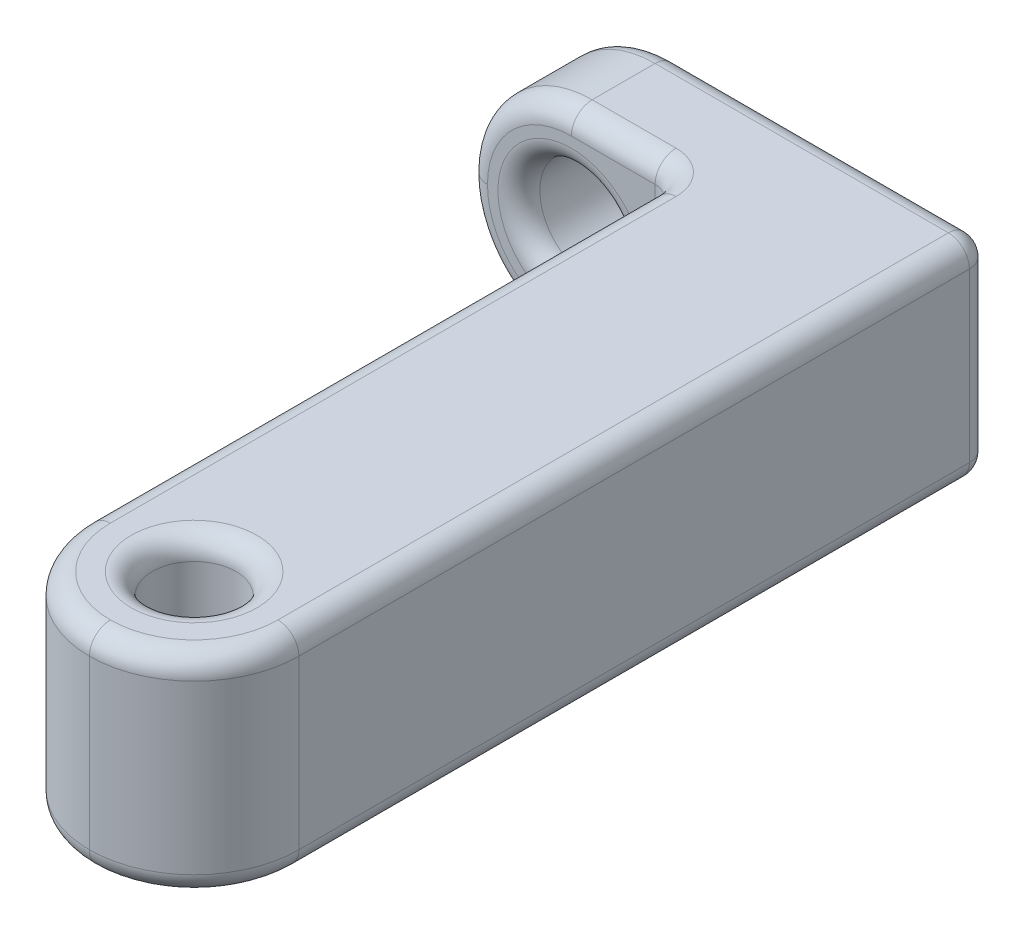
ISO-10303-21;
HEADER;
FILE_DESCRIPTION(('STEP AP214'),'2;1');
FILE_NAME('part.step','',(''),(''),'','','');
FILE_SCHEMA(('AUTOMOTIVE_DESIGN { 1 0 10303 214 1 1 1 1 }'));
ENDSEC;
DATA;
#1=APPLICATION_CONTEXT('core data for automotive mechanical design processes');
#2=APPLICATION_PROTOCOL_DEFINITION('international standard','automotive_design',2000,#1);
#3=PRODUCT_CONTEXT('',#1,'mechanical');
#4=PRODUCT('Part','Part','',(#3));
#5=PRODUCT_RELATED_PRODUCT_CATEGORY('part','',(#4));
#6=PRODUCT_DEFINITION_FORMATION('','',#4);
#7=PRODUCT_DEFINITION_CONTEXT('part definition',#1,'design');
#8=PRODUCT_DEFINITION('design','',#6,#7);
#9=PRODUCT_DEFINITION_SHAPE('','',#8);
#10=(LENGTH_UNIT() NAMED_UNIT(*) SI_UNIT(.MILLI.,.METRE.));
#11=(NAMED_UNIT(*) PLANE_ANGLE_UNIT() SI_UNIT($,.RADIAN.));
#12=(NAMED_UNIT(*) SI_UNIT($,.STERADIAN.) SOLID_ANGLE_UNIT());
#13=UNCERTAINTY_MEASURE_WITH_UNIT(LENGTH_MEASURE(1.E-05),#10,'distance_accuracy_value','');
#14=(GEOMETRIC_REPRESENTATION_CONTEXT(3) GLOBAL_UNCERTAINTY_ASSIGNED_CONTEXT((#13)) GLOBAL_UNIT_ASSIGNED_CONTEXT((#10,
#11,#12)) REPRESENTATION_CONTEXT('',''));
#15=CARTESIAN_POINT('',(0.,0.,0.));
#16=DIRECTION('',(0.,0.,1.));
#17=DIRECTION('',(1.,0.,0.));
#18=AXIS2_PLACEMENT_3D('',#15,#16,#17);
#19=CARTESIAN_POINT('',(0.,5.,5.));
#20=DIRECTION('',(0.,1.,0.));
#21=DIRECTION('',(0.,0.,1.));
#22=AXIS2_PLACEMENT_3D('',#19,#20,#21);
#23=PLANE('',#22);
#24=CARTESIAN_POINT('',(5.,5.,33.));
#25=DIRECTION('',(0.,1.,0.));
#26=DIRECTION('',(0.,0.,1.));
#27=AXIS2_PLACEMENT_3D('',#24,#25,#26);
#28=CIRCLE('',#27,3.);
#29=CARTESIAN_POINT('',(5.,5.,36.));
#30=VERTEX_POINT('',#29);
#31=EDGE_CURVE('E252',#30,#30,#28,.F.);
#32=ORIENTED_EDGE('',*,*,#31,.T.);
#33=EDGE_LOOP('',(#32));
#34=FACE_BOUND('',#33,.T.);
#35=DIRECTION('',(0.,0.,-1.));
#36=VECTOR('',#35,1.);
#37=CARTESIAN_POINT('',(-5.,5.,5.));
#38=LINE('',#37,#36);
#39=CARTESIAN_POINT('',(-5.,5.,1.));
#40=VERTEX_POINT('',#39);
#41=CARTESIAN_POINT('',(-5.,5.,4.));
#42=VERTEX_POINT('',#41);
#43=EDGE_CURVE('E447',#40,#42,#38,.F.);
#44=ORIENTED_EDGE('',*,*,#43,.T.);
#45=DIRECTION('',(1.,0.,0.));
#46=VECTOR('',#45,1.);
#47=CARTESIAN_POINT('',(0.,5.,4.));
#48=LINE('',#47,#46);
#49=CARTESIAN_POINT('',(-1.,5.,4.));
#50=VERTEX_POINT('',#49);
#51=EDGE_CURVE('E249',#42,#50,#48,.T.);
#52=ORIENTED_EDGE('',*,*,#51,.T.);
#53=CARTESIAN_POINT('',(-1.,5.,6.));
#54=DIRECTION('',(0.,1.,0.));
#55=DIRECTION('',(0.,0.,1.));
#56=AXIS2_PLACEMENT_3D('',#53,#54,#55);
#57=CIRCLE('',#56,2.);
#58=CARTESIAN_POINT('',(1.,5.,6.));
#59=VERTEX_POINT('',#58);
#60=EDGE_CURVE('E245',#59,#50,#57,.T.);
#61=ORIENTED_EDGE('',*,*,#60,.F.);
#62=DIRECTION('',(0.,0.,-1.));
#63=VECTOR('',#62,1.);
#64=CARTESIAN_POINT('',(1.,5.,33.));
#65=LINE('',#64,#63);
#66=CARTESIAN_POINT('',(1.,5.,33.));
#67=VERTEX_POINT('',#66);
#68=EDGE_CURVE('E235',#59,#67,#65,.F.);
#69=ORIENTED_EDGE('',*,*,#68,.T.);
#70=CARTESIAN_POINT('',(5.,5.,33.));
#71=DIRECTION('',(0.,1.,0.));
#72=DIRECTION('',(0.,0.,1.));
#73=AXIS2_PLACEMENT_3D('',#70,#71,#72);
#74=CIRCLE('',#73,4.);
#75=CARTESIAN_POINT('',(5.,5.,37.));
#76=VERTEX_POINT('',#75);
#77=EDGE_CURVE('E232',#67,#76,#74,.T.);
#78=ORIENTED_EDGE('',*,*,#77,.T.);
#79=CARTESIAN_POINT('',(5.,5.,33.));
#80=DIRECTION('',(0.,1.,0.));
#81=DIRECTION('',(0.,0.,1.));
#82=AXIS2_PLACEMENT_3D('',#79,#80,#81);
#83=CIRCLE('',#82,4.);
#84=CARTESIAN_POINT('',(9.00000000000001,5.,33.));
#85=VERTEX_POINT('',#84);
#86=EDGE_CURVE('E229',#76,#85,#83,.T.);
#87=ORIENTED_EDGE('',*,*,#86,.T.);
#88=DIRECTION('',(0.,0.,-1.));
#89=VECTOR('',#88,1.);
#90=CARTESIAN_POINT('',(9.00000000000001,5.,0.));
#91=LINE('',#90,#89);
#92=CARTESIAN_POINT('',(9.00000000000001,5.,1.));
#93=VERTEX_POINT('',#92);
#94=EDGE_CURVE('E238',#85,#93,#91,.T.);
#95=ORIENTED_EDGE('',*,*,#94,.T.);
#96=DIRECTION('',(1.,0.,0.));
#97=VECTOR('',#96,1.);
#98=CARTESIAN_POINT('',(-5.,5.,1.));
#99=LINE('',#98,#97);
#100=EDGE_CURVE('E241',#93,#40,#99,.F.);
#101=ORIENTED_EDGE('',*,*,#100,.T.);
#102=EDGE_LOOP('',(#44,#52,#61,#69,#78,#87,#95,#101));
#103=FACE_BOUND('',#102,.T.);
#104=ADVANCED_FACE('F45',(#34,#103),#23,.T.);
#105=CARTESIAN_POINT('',(0.,-5.,5.));
#106=DIRECTION('',(0.,1.,0.));
#107=DIRECTION('',(0.,0.,1.));
#108=AXIS2_PLACEMENT_3D('',#105,#106,#107);
#109=PLANE('',#108);
#110=CARTESIAN_POINT('',(5.,-5.,33.));
#111=DIRECTION('',(0.,1.,0.));
#112=DIRECTION('',(0.,0.,1.));
#113=AXIS2_PLACEMENT_3D('',#110,#111,#112);
#114=CIRCLE('',#113,3.);
#115=CARTESIAN_POINT('',(5.,-5.,36.));
#116=VERTEX_POINT('',#115);
#117=EDGE_CURVE('E296',#116,#116,#114,.T.);
#118=ORIENTED_EDGE('',*,*,#117,.T.);
#119=EDGE_LOOP('',(#118));
#120=FACE_BOUND('',#119,.T.);
#121=CARTESIAN_POINT('',(-0.999999999999999,-5.,6.));
#122=DIRECTION('',(0.,1.,0.));
#123=DIRECTION('',(0.,0.,1.));
#124=AXIS2_PLACEMENT_3D('',#121,#122,#123);
#125=CIRCLE('',#124,2.);
#126=CARTESIAN_POINT('',(-0.999999999999999,-5.,4.));
#127=VERTEX_POINT('',#126);
#128=CARTESIAN_POINT('',(1.,-5.,6.));
#129=VERTEX_POINT('',#128);
#130=EDGE_CURVE('E289',#127,#129,#125,.F.);
#131=ORIENTED_EDGE('',*,*,#130,.F.);
#132=DIRECTION('',(1.,0.,0.));
#133=VECTOR('',#132,1.);
#134=CARTESIAN_POINT('',(-5.,-5.,4.));
#135=LINE('',#134,#133);
#136=CARTESIAN_POINT('',(-5.,-5.,4.));
#137=VERTEX_POINT('',#136);
#138=EDGE_CURVE('E293',#127,#137,#135,.F.);
#139=ORIENTED_EDGE('',*,*,#138,.T.);
#140=DIRECTION('',(0.,0.,-1.));
#141=VECTOR('',#140,1.);
#142=CARTESIAN_POINT('',(-5.,-5.,0.));
#143=LINE('',#142,#141);
#144=CARTESIAN_POINT('',(-5.,-5.,1.));
#145=VERTEX_POINT('',#144);
#146=EDGE_CURVE('E453',#137,#145,#143,.T.);
#147=ORIENTED_EDGE('',*,*,#146,.T.);
#148=DIRECTION('',(1.,0.,0.));
#149=VECTOR('',#148,1.);
#150=CARTESIAN_POINT('',(0.,-5.,1.));
#151=LINE('',#150,#149);
#152=CARTESIAN_POINT('',(9.00000000000001,-5.,1.));
#153=VERTEX_POINT('',#152);
#154=EDGE_CURVE('E286',#145,#153,#151,.T.);
#155=ORIENTED_EDGE('',*,*,#154,.T.);
#156=DIRECTION('',(0.,0.,-1.));
#157=VECTOR('',#156,1.);
#158=CARTESIAN_POINT('',(9.00000000000001,-5.,5.));
#159=LINE('',#158,#157);
#160=CARTESIAN_POINT('',(9.00000000000001,-5.,33.));
#161=VERTEX_POINT('',#160);
#162=EDGE_CURVE('E280',#153,#161,#159,.F.);
#163=ORIENTED_EDGE('',*,*,#162,.T.);
#164=CARTESIAN_POINT('',(5.,-5.,33.));
#165=DIRECTION('',(0.,1.,0.));
#166=DIRECTION('',(0.,0.,1.));
#167=AXIS2_PLACEMENT_3D('',#164,#165,#166);
#168=CIRCLE('',#167,4.);
#169=CARTESIAN_POINT('',(5.,-5.,37.));
#170=VERTEX_POINT('',#169);
#171=EDGE_CURVE('E274',#161,#170,#168,.F.);
#172=ORIENTED_EDGE('',*,*,#171,.T.);
#173=CARTESIAN_POINT('',(5.,-5.,33.));
#174=DIRECTION('',(0.,1.,0.));
#175=DIRECTION('',(0.,0.,1.));
#176=AXIS2_PLACEMENT_3D('',#173,#174,#175);
#177=CIRCLE('',#176,4.);
#178=CARTESIAN_POINT('',(1.,-5.,33.));
#179=VERTEX_POINT('',#178);
#180=EDGE_CURVE('E277',#170,#179,#177,.F.);
#181=ORIENTED_EDGE('',*,*,#180,.T.);
#182=DIRECTION('',(0.,0.,-1.));
#183=VECTOR('',#182,1.);
#184=CARTESIAN_POINT('',(1.,-5.,5.));
#185=LINE('',#184,#183);
#186=EDGE_CURVE('E283',#179,#129,#185,.T.);
#187=ORIENTED_EDGE('',*,*,#186,.T.);
#188=EDGE_LOOP('',(#131,#139,#147,#155,#163,#172,#181,#187));
#189=FACE_BOUND('',#188,.T.);
#190=ADVANCED_FACE('F464',(#120,#189),#109,.F.);
#191=CARTESIAN_POINT('',(-5.,0.,5.));
#192=DIRECTION('',(0.,0.,-1.));
#193=DIRECTION('',(-1.,0.,0.));
#194=AXIS2_PLACEMENT_3D('',#191,#192,#193);
#195=CYLINDRICAL_SURFACE('',#194,2.5);
#196=CARTESIAN_POINT('',(-5.,0.,1.));
#197=DIRECTION('',(0.,0.,1.));
#198=DIRECTION('',(1.,0.,0.));
#199=AXIS2_PLACEMENT_3D('',#196,#197,#198);
#200=CIRCLE('',#199,2.5);
#201=CARTESIAN_POINT('',(-2.5,0.,1.));
#202=VERTEX_POINT('',#201);
#203=EDGE_CURVE('E313',#202,#202,#200,.F.);
#204=ORIENTED_EDGE('',*,*,#203,.T.);
#205=EDGE_LOOP('',(#204));
#206=FACE_BOUND('',#205,.T.);
#207=CARTESIAN_POINT('',(-5.,0.,4.));
#208=DIRECTION('',(0.,0.,1.));
#209=DIRECTION('',(1.,0.,0.));
#210=AXIS2_PLACEMENT_3D('',#207,#208,#209);
#211=CIRCLE('',#210,2.5);
#212=CARTESIAN_POINT('',(-2.5,0.,4.));
#213=VERTEX_POINT('',#212);
#214=EDGE_CURVE('E309',#213,#213,#211,.T.);
#215=ORIENTED_EDGE('',*,*,#214,.T.);
#216=EDGE_LOOP('',(#215));
#217=FACE_BOUND('',#216,.T.);
#218=ADVANCED_FACE('F521',(#206,#217),#195,.F.);
#219=CARTESIAN_POINT('',(0.,0.,5.));
#220=DIRECTION('',(0.,0.,1.));
#221=DIRECTION('',(1.,0.,0.));
#222=AXIS2_PLACEMENT_3D('',#219,#220,#221);
#223=PLANE('',#222);
#224=CARTESIAN_POINT('',(-5.,0.,5.));
#225=DIRECTION('',(0.,0.,1.));
#226=DIRECTION('',(1.,0.,0.));
#227=AXIS2_PLACEMENT_3D('',#224,#225,#226);
#228=CIRCLE('',#227,3.5);
#229=CARTESIAN_POINT('',(-1.5,0.,5.));
#230=VERTEX_POINT('',#229);
#231=EDGE_CURVE('E333',#230,#230,#228,.F.);
#232=ORIENTED_EDGE('',*,*,#231,.T.);
#233=EDGE_LOOP('',(#232));
#234=FACE_BOUND('',#233,.T.);
#235=DIRECTION('',(1.,0.,0.));
#236=VECTOR('',#235,1.);
#237=CARTESIAN_POINT('',(0.,-4.,5.));
#238=LINE('',#237,#236);
#239=CARTESIAN_POINT('',(-5.,-4.,5.));
#240=VERTEX_POINT('',#239);
#241=CARTESIAN_POINT('',(-0.999999999999999,-4.,5.));
#242=VERTEX_POINT('',#241);
#243=EDGE_CURVE('E323',#240,#242,#238,.T.);
#244=ORIENTED_EDGE('',*,*,#243,.T.);
#245=DIRECTION('',(0.,-1.,0.));
#246=VECTOR('',#245,1.);
#247=CARTESIAN_POINT('',(-0.999999999999999,0.,5.));
#248=LINE('',#247,#246);
#249=CARTESIAN_POINT('',(-1.,4.,5.));
#250=VERTEX_POINT('',#249);
#251=EDGE_CURVE('E330',#242,#250,#248,.F.);
#252=ORIENTED_EDGE('',*,*,#251,.T.);
#253=DIRECTION('',(1.,0.,0.));
#254=VECTOR('',#253,1.);
#255=CARTESIAN_POINT('',(0.,4.,5.));
#256=LINE('',#255,#254);
#257=CARTESIAN_POINT('',(-5.,4.,5.));
#258=VERTEX_POINT('',#257);
#259=EDGE_CURVE('E326',#250,#258,#256,.F.);
#260=ORIENTED_EDGE('',*,*,#259,.T.);
#261=CARTESIAN_POINT('',(-5.,0.,5.));
#262=DIRECTION('',(0.,0.,1.));
#263=DIRECTION('',(1.,0.,0.));
#264=AXIS2_PLACEMENT_3D('',#261,#262,#263);
#265=CIRCLE('',#264,4.);
#266=CARTESIAN_POINT('',(-9.,0.,5.));
#267=VERTEX_POINT('',#266);
#268=EDGE_CURVE('E317',#258,#267,#265,.T.);
#269=ORIENTED_EDGE('',*,*,#268,.T.);
#270=CARTESIAN_POINT('',(-5.,0.,5.));
#271=DIRECTION('',(0.,0.,1.));
#272=DIRECTION('',(1.,0.,0.));
#273=AXIS2_PLACEMENT_3D('',#270,#271,#272);
#274=CIRCLE('',#273,4.);
#275=EDGE_CURVE('E320',#267,#240,#274,.T.);
#276=ORIENTED_EDGE('',*,*,#275,.T.);
#277=EDGE_LOOP('',(#244,#252,#260,#269,#276));
#278=FACE_BOUND('',#277,.T.);
#279=ADVANCED_FACE('F528',(#234,#278),#223,.T.);
#280=CARTESIAN_POINT('',(0.,0.,0.));
#281=DIRECTION('',(0.,0.,1.));
#282=DIRECTION('',(1.,0.,0.));
#283=AXIS2_PLACEMENT_3D('',#280,#281,#282);
#284=PLANE('',#283);
#285=CARTESIAN_POINT('',(-5.,0.,0.));
#286=DIRECTION('',(0.,0.,1.));
#287=DIRECTION('',(1.,0.,0.));
#288=AXIS2_PLACEMENT_3D('',#285,#286,#287);
#289=CIRCLE('',#288,3.5);
#290=CARTESIAN_POINT('',(-1.5,0.,0.));
#291=VERTEX_POINT('',#290);
#292=EDGE_CURVE('E225',#291,#291,#289,.T.);
#293=ORIENTED_EDGE('',*,*,#292,.T.);
#294=EDGE_LOOP('',(#293));
#295=FACE_BOUND('',#294,.T.);
#296=CARTESIAN_POINT('',(-5.,0.,0.));
#297=DIRECTION('',(0.,0.,1.));
#298=DIRECTION('',(1.,0.,0.));
#299=AXIS2_PLACEMENT_3D('',#296,#297,#298);
#300=CIRCLE('',#299,4.);
#301=CARTESIAN_POINT('',(-9.,0.,0.));
#302=VERTEX_POINT('',#301);
#303=CARTESIAN_POINT('',(-5.,4.,0.));
#304=VERTEX_POINT('',#303);
#305=EDGE_CURVE('E183',#302,#304,#300,.F.);
#306=ORIENTED_EDGE('',*,*,#305,.T.);
#307=DIRECTION('',(1.,0.,0.));
#308=VECTOR('',#307,1.);
#309=CARTESIAN_POINT('',(10.,4.,0.));
#310=LINE('',#309,#308);
#311=CARTESIAN_POINT('',(9.00000000000001,4.,0.));
#312=VERTEX_POINT('',#311);
#313=EDGE_CURVE('E222',#304,#312,#310,.T.);
#314=ORIENTED_EDGE('',*,*,#313,.T.);
#315=DIRECTION('',(0.,1.,0.));
#316=VECTOR('',#315,1.);
#317=CARTESIAN_POINT('',(9.00000000000001,0.,0.));
#318=LINE('',#317,#316);
#319=CARTESIAN_POINT('',(9.00000000000001,-4.,0.));
#320=VERTEX_POINT('',#319);
#321=EDGE_CURVE('E219',#312,#320,#318,.F.);
#322=ORIENTED_EDGE('',*,*,#321,.T.);
#323=DIRECTION('',(1.,0.,0.));
#324=VECTOR('',#323,1.);
#325=CARTESIAN_POINT('',(0.,-4.,0.));
#326=LINE('',#325,#324);
#327=CARTESIAN_POINT('',(-5.,-4.,0.));
#328=VERTEX_POINT('',#327);
#329=EDGE_CURVE('E186',#320,#328,#326,.F.);
#330=ORIENTED_EDGE('',*,*,#329,.T.);
#331=CARTESIAN_POINT('',(-5.,0.,0.));
#332=DIRECTION('',(0.,0.,1.));
#333=DIRECTION('',(1.,0.,0.));
#334=AXIS2_PLACEMENT_3D('',#331,#332,#333);
#335=CIRCLE('',#334,4.);
#336=EDGE_CURVE('E178',#328,#302,#335,.F.);
#337=ORIENTED_EDGE('',*,*,#336,.T.);
#338=EDGE_LOOP('',(#306,#314,#322,#330,#337));
#339=FACE_BOUND('',#338,.T.);
#340=ADVANCED_FACE('F180',(#295,#339),#284,.F.);
#341=CARTESIAN_POINT('',(0.,0.,38.));
#342=DIRECTION('',(1.,0.,0.));
#343=DIRECTION('',(0.,1.,0.));
#344=AXIS2_PLACEMENT_3D('',#341,#342,#343);
#345=PLANE('',#344);
#346=DIRECTION('',(0.,-1.,0.));
#347=VECTOR('',#346,1.);
#348=CARTESIAN_POINT('',(0.,0.,6.));
#349=LINE('',#348,#347);
#350=CARTESIAN_POINT('',(0.,4.,6.));
#351=VERTEX_POINT('',#350);
#352=CARTESIAN_POINT('',(0.,-4.,6.));
#353=VERTEX_POINT('',#352);
#354=EDGE_CURVE('E300',#351,#353,#349,.T.);
#355=ORIENTED_EDGE('',*,*,#354,.T.);
#356=DIRECTION('',(0.,0.,-1.));
#357=VECTOR('',#356,1.);
#358=CARTESIAN_POINT('',(0.,-4.,38.));
#359=LINE('',#358,#357);
#360=CARTESIAN_POINT('',(0.,-4.,33.));
#361=VERTEX_POINT('',#360);
#362=EDGE_CURVE('E306',#353,#361,#359,.F.);
#363=ORIENTED_EDGE('',*,*,#362,.T.);
#364=DIRECTION('',(0.,-1.,0.));
#365=VECTOR('',#364,1.);
#366=CARTESIAN_POINT('',(0.,5.,33.));
#367=LINE('',#366,#365);
#368=CARTESIAN_POINT('',(0.,4.,33.));
#369=VERTEX_POINT('',#368);
#370=EDGE_CURVE('E207',#361,#369,#367,.F.);
#371=ORIENTED_EDGE('',*,*,#370,.T.);
#372=DIRECTION('',(0.,0.,-1.));
#373=VECTOR('',#372,1.);
#374=CARTESIAN_POINT('',(0.,4.,5.));
#375=LINE('',#374,#373);
#376=EDGE_CURVE('E303',#369,#351,#375,.T.);
#377=ORIENTED_EDGE('',*,*,#376,.T.);
#378=EDGE_LOOP('',(#355,#363,#371,#377));
#379=FACE_BOUND('',#378,.T.);
#380=ADVANCED_FACE('F843',(#379),#345,.F.);
#381=CARTESIAN_POINT('',(10.,0.,38.));
#382=DIRECTION('',(-1.,0.,0.));
#383=DIRECTION('',(0.,0.,1.));
#384=AXIS2_PLACEMENT_3D('',#381,#382,#383);
#385=PLANE('',#384);
#386=DIRECTION('',(0.,1.,0.));
#387=VECTOR('',#386,1.);
#388=CARTESIAN_POINT('',(10.,0.,1.));
#389=LINE('',#388,#387);
#390=CARTESIAN_POINT('',(10.,-4.,1.));
#391=VERTEX_POINT('',#390);
#392=CARTESIAN_POINT('',(10.,4.,1.));
#393=VERTEX_POINT('',#392);
#394=EDGE_CURVE('E259',#391,#393,#389,.T.);
#395=ORIENTED_EDGE('',*,*,#394,.T.);
#396=DIRECTION('',(0.,0.,-1.));
#397=VECTOR('',#396,1.);
#398=CARTESIAN_POINT('',(10.,4.,33.));
#399=LINE('',#398,#397);
#400=CARTESIAN_POINT('',(10.,4.,33.));
#401=VERTEX_POINT('',#400);
#402=EDGE_CURVE('E263',#393,#401,#399,.F.);
#403=ORIENTED_EDGE('',*,*,#402,.T.);
#404=DIRECTION('',(0.,1.,0.));
#405=VECTOR('',#404,1.);
#406=CARTESIAN_POINT('',(10.,-5.,33.));
#407=LINE('',#406,#405);
#408=CARTESIAN_POINT('',(10.,-4.,33.));
#409=VERTEX_POINT('',#408);
#410=EDGE_CURVE('E211',#401,#409,#407,.F.);
#411=ORIENTED_EDGE('',*,*,#410,.T.);
#412=DIRECTION('',(0.,0.,-1.));
#413=VECTOR('',#412,1.);
#414=CARTESIAN_POINT('',(10.,-4.,38.));
#415=LINE('',#414,#413);
#416=EDGE_CURVE('E256',#409,#391,#415,.T.);
#417=ORIENTED_EDGE('',*,*,#416,.T.);
#418=EDGE_LOOP('',(#395,#403,#411,#417));
#419=FACE_BOUND('',#418,.T.);
#420=ADVANCED_FACE('F511',(#419),#385,.F.);
#421=CARTESIAN_POINT('',(5.,5.001,33.));
#422=DIRECTION('',(0.,-1.,0.));
#423=DIRECTION('',(0.,0.,-1.));
#424=AXIS2_PLACEMENT_3D('',#421,#422,#423);
#425=CYLINDRICAL_SURFACE('',#424,2.);
#426=CARTESIAN_POINT('',(5.,4.,33.));
#427=DIRECTION('',(0.,1.,0.));
#428=DIRECTION('',(0.,0.,1.));
#429=AXIS2_PLACEMENT_3D('',#426,#427,#428);
#430=CIRCLE('',#429,2.);
#431=CARTESIAN_POINT('',(5.,4.,35.));
#432=VERTEX_POINT('',#431);
#433=EDGE_CURVE('E270',#432,#432,#430,.T.);
#434=ORIENTED_EDGE('',*,*,#433,.T.);
#435=EDGE_LOOP('',(#434));
#436=FACE_BOUND('',#435,.T.);
#437=CARTESIAN_POINT('',(5.,-4.,33.));
#438=DIRECTION('',(0.,1.,0.));
#439=DIRECTION('',(0.,0.,1.));
#440=AXIS2_PLACEMENT_3D('',#437,#438,#439);
#441=CIRCLE('',#440,2.);
#442=CARTESIAN_POINT('',(5.,-4.,35.));
#443=VERTEX_POINT('',#442);
#444=EDGE_CURVE('E266',#443,#443,#441,.F.);
#445=ORIENTED_EDGE('',*,*,#444,.T.);
#446=EDGE_LOOP('',(#445));
#447=FACE_BOUND('',#446,.T.);
#448=ADVANCED_FACE('F503',(#436,#447),#425,.F.);
#449=CARTESIAN_POINT('',(-5.,0.,5.));
#450=DIRECTION('',(0.,0.,1.));
#451=DIRECTION('',(1.,0.,0.));
#452=AXIS2_PLACEMENT_3D('',#449,#450,#451);
#453=CYLINDRICAL_SURFACE('',#452,5.);
#454=DIRECTION('',(0.,0.,-1.));
#455=VECTOR('',#454,1.);
#456=CARTESIAN_POINT('',(-10.,0.,5.));
#457=LINE('',#456,#455);
#458=CARTESIAN_POINT('',(-10.,0.,1.));
#459=VERTEX_POINT('',#458);
#460=CARTESIAN_POINT('',(-10.,0.,4.));
#461=VERTEX_POINT('',#460);
#462=EDGE_CURVE('E443',#459,#461,#457,.F.);
#463=ORIENTED_EDGE('',*,*,#462,.F.);
#464=CARTESIAN_POINT('',(-5.,0.,1.));
#465=DIRECTION('',(0.,0.,1.));
#466=DIRECTION('',(1.,0.,0.));
#467=AXIS2_PLACEMENT_3D('',#464,#465,#466);
#468=CIRCLE('',#467,5.);
#469=EDGE_CURVE('E196',#459,#145,#468,.T.);
#470=ORIENTED_EDGE('',*,*,#469,.T.);
#471=ORIENTED_EDGE('',*,*,#146,.F.);
#472=CARTESIAN_POINT('',(-5.,0.,4.));
#473=DIRECTION('',(0.,0.,1.));
#474=DIRECTION('',(1.,0.,0.));
#475=AXIS2_PLACEMENT_3D('',#472,#473,#474);
#476=CIRCLE('',#475,5.);
#477=EDGE_CURVE('E337',#137,#461,#476,.F.);
#478=ORIENTED_EDGE('',*,*,#477,.T.);
#479=EDGE_LOOP('',(#463,#470,#471,#478));
#480=FACE_BOUND('',#479,.T.);
#481=ADVANCED_FACE('F500',(#480),#453,.T.);
#482=CARTESIAN_POINT('',(-5.,0.,5.));
#483=DIRECTION('',(0.,0.,-1.));
#484=DIRECTION('',(-1.,0.,0.));
#485=AXIS2_PLACEMENT_3D('',#482,#483,#484);
#486=CYLINDRICAL_SURFACE('',#485,5.);
#487=ORIENTED_EDGE('',*,*,#43,.F.);
#488=CARTESIAN_POINT('',(-5.,0.,1.));
#489=DIRECTION('',(0.,0.,1.));
#490=DIRECTION('',(1.,0.,0.));
#491=AXIS2_PLACEMENT_3D('',#488,#489,#490);
#492=CIRCLE('',#491,5.);
#493=EDGE_CURVE('E345',#40,#459,#492,.T.);
#494=ORIENTED_EDGE('',*,*,#493,.T.);
#495=ORIENTED_EDGE('',*,*,#462,.T.);
#496=CARTESIAN_POINT('',(-5.,0.,4.));
#497=DIRECTION('',(0.,0.,1.));
#498=DIRECTION('',(1.,0.,0.));
#499=AXIS2_PLACEMENT_3D('',#496,#497,#498);
#500=CIRCLE('',#499,5.);
#501=EDGE_CURVE('E342',#461,#42,#500,.F.);
#502=ORIENTED_EDGE('',*,*,#501,.T.);
#503=EDGE_LOOP('',(#487,#494,#495,#502));
#504=FACE_BOUND('',#503,.T.);
#505=ADVANCED_FACE('F502',(#504),#486,.T.);
#506=CARTESIAN_POINT('',(5.,0.,33.));
#507=DIRECTION('',(0.,1.,0.));
#508=DIRECTION('',(-1.,0.,0.));
#509=AXIS2_PLACEMENT_3D('',#506,#507,#508);
#510=CYLINDRICAL_SURFACE('',#509,5.);
#511=DIRECTION('',(0.,-1.,0.));
#512=VECTOR('',#511,1.);
#513=CARTESIAN_POINT('',(5.,-5.,38.));
#514=LINE('',#513,#512);
#515=CARTESIAN_POINT('',(5.,4.,38.));
#516=VERTEX_POINT('',#515);
#517=CARTESIAN_POINT('',(5.,-4.,38.));
#518=VERTEX_POINT('',#517);
#519=EDGE_CURVE('E214',#516,#518,#514,.T.);
#520=ORIENTED_EDGE('',*,*,#519,.F.);
#521=CARTESIAN_POINT('',(5.,4.,33.));
#522=DIRECTION('',(0.,1.,0.));
#523=DIRECTION('',(0.,0.,1.));
#524=AXIS2_PLACEMENT_3D('',#521,#522,#523);
#525=CIRCLE('',#524,5.);
#526=EDGE_CURVE('E350',#516,#369,#525,.F.);
#527=ORIENTED_EDGE('',*,*,#526,.T.);
#528=ORIENTED_EDGE('',*,*,#370,.F.);
#529=CARTESIAN_POINT('',(5.,-4.,33.));
#530=DIRECTION('',(0.,1.,0.));
#531=DIRECTION('',(0.,0.,1.));
#532=AXIS2_PLACEMENT_3D('',#529,#530,#531);
#533=CIRCLE('',#532,5.);
#534=EDGE_CURVE('E63',#361,#518,#533,.T.);
#535=ORIENTED_EDGE('',*,*,#534,.T.);
#536=EDGE_LOOP('',(#520,#527,#528,#535));
#537=FACE_BOUND('',#536,.T.);
#538=ADVANCED_FACE('F509',(#537),#510,.T.);
#539=CARTESIAN_POINT('',(5.,0.,33.));
#540=DIRECTION('',(0.,-1.,0.));
#541=DIRECTION('',(0.,0.,-1.));
#542=AXIS2_PLACEMENT_3D('',#539,#540,#541);
#543=CYLINDRICAL_SURFACE('',#542,5.);
#544=ORIENTED_EDGE('',*,*,#410,.F.);
#545=CARTESIAN_POINT('',(5.,4.,33.));
#546=DIRECTION('',(0.,1.,0.));
#547=DIRECTION('',(0.,0.,1.));
#548=AXIS2_PLACEMENT_3D('',#545,#546,#547);
#549=CIRCLE('',#548,5.);
#550=EDGE_CURVE('E11',#401,#516,#549,.F.);
#551=ORIENTED_EDGE('',*,*,#550,.T.);
#552=ORIENTED_EDGE('',*,*,#519,.T.);
#553=CARTESIAN_POINT('',(5.,-4.,33.));
#554=DIRECTION('',(0.,1.,0.));
#555=DIRECTION('',(0.,0.,1.));
#556=AXIS2_PLACEMENT_3D('',#553,#554,#555);
#557=CIRCLE('',#556,5.);
#558=EDGE_CURVE('E55',#518,#409,#557,.T.);
#559=ORIENTED_EDGE('',*,*,#558,.T.);
#560=EDGE_LOOP('',(#544,#551,#552,#559));
#561=FACE_BOUND('',#560,.T.);
#562=ADVANCED_FACE('F571',(#561),#543,.T.);
#563=CARTESIAN_POINT('',(0.,-4.,4.));
#564=DIRECTION('',(-1.,0.,0.));
#565=DIRECTION('',(0.,0.,1.));
#566=AXIS2_PLACEMENT_3D('',#563,#564,#565);
#567=CYLINDRICAL_SURFACE('',#566,1.);
#568=CARTESIAN_POINT('',(-0.999999999999999,-4.,4.));
#569=DIRECTION('',(1.,0.,0.));
#570=DIRECTION('',(0.,0.,-1.));
#571=AXIS2_PLACEMENT_3D('',#568,#569,#570);
#572=CIRCLE('',#571,1.);
#573=EDGE_CURVE('E430',#242,#127,#572,.T.);
#574=ORIENTED_EDGE('',*,*,#573,.F.);
#575=ORIENTED_EDGE('',*,*,#243,.F.);
#576=CARTESIAN_POINT('',(-5.,-4.,4.));
#577=DIRECTION('',(-1.,0.,0.));
#578=DIRECTION('',(0.,0.,1.));
#579=AXIS2_PLACEMENT_3D('',#576,#577,#578);
#580=CIRCLE('',#579,1.);
#581=EDGE_CURVE('E49',#137,#240,#580,.T.);
#582=ORIENTED_EDGE('',*,*,#581,.F.);
#583=ORIENTED_EDGE('',*,*,#138,.F.);
#584=EDGE_LOOP('',(#574,#575,#582,#583));
#585=FACE_BOUND('',#584,.T.);
#586=ADVANCED_FACE('F496',(#585),#567,.T.);
#587=CARTESIAN_POINT('',(-5.,0.,4.));
#588=DIRECTION('',(0.,0.,1.));
#589=DIRECTION('',(1.,0.,0.));
#590=AXIS2_PLACEMENT_3D('',#587,#588,#589);
#591=TOROIDAL_SURFACE('',#590,4.,1.);
#592=ORIENTED_EDGE('',*,*,#581,.T.);
#593=ORIENTED_EDGE('',*,*,#275,.F.);
#594=CARTESIAN_POINT('',(-9.,0.,4.));
#595=DIRECTION('',(0.,1.,0.));
#596=DIRECTION('',(0.,0.,1.));
#597=AXIS2_PLACEMENT_3D('',#594,#595,#596);
#598=CIRCLE('',#597,1.);
#599=EDGE_CURVE('E427',#461,#267,#598,.T.);
#600=ORIENTED_EDGE('',*,*,#599,.F.);
#601=ORIENTED_EDGE('',*,*,#477,.F.);
#602=EDGE_LOOP('',(#592,#593,#600,#601));
#603=FACE_BOUND('',#602,.T.);
#604=ADVANCED_FACE('F498',(#603),#591,.T.);
#605=CARTESIAN_POINT('',(-0.999999999999999,-4.,6.));
#606=DIRECTION('',(0.,1.,0.));
#607=DIRECTION('',(0.,0.,1.));
#608=AXIS2_PLACEMENT_3D('',#605,#606,#607);
#609=TOROIDAL_SURFACE('',#608,2.,1.);
#610=ORIENTED_EDGE('',*,*,#573,.T.);
#611=ORIENTED_EDGE('',*,*,#130,.T.);
#612=CARTESIAN_POINT('',(1.,-4.,6.));
#613=DIRECTION('',(0.,0.,-1.));
#614=DIRECTION('',(-1.,0.,0.));
#615=AXIS2_PLACEMENT_3D('',#612,#613,#614);
#616=CIRCLE('',#615,1.);
#617=EDGE_CURVE('E423',#353,#129,#616,.F.);
#618=ORIENTED_EDGE('',*,*,#617,.F.);
#619=CARTESIAN_POINT('',(-0.999999999999999,-4.,6.));
#620=DIRECTION('',(0.,1.,0.));
#621=DIRECTION('',(0.,0.,1.));
#622=AXIS2_PLACEMENT_3D('',#619,#620,#621);
#623=CIRCLE('',#622,1.);
#624=EDGE_CURVE('E419',#242,#353,#623,.F.);
#625=ORIENTED_EDGE('',*,*,#624,.F.);
#626=EDGE_LOOP('',(#610,#611,#618,#625));
#627=FACE_BOUND('',#626,.T.);
#628=ADVANCED_FACE('F493',(#627),#609,.T.);
#629=CARTESIAN_POINT('',(-5.,0.,4.));
#630=DIRECTION('',(0.,0.,1.));
#631=DIRECTION('',(1.,0.,0.));
#632=AXIS2_PLACEMENT_3D('',#629,#630,#631);
#633=TOROIDAL_SURFACE('',#632,4.,1.);
#634=ORIENTED_EDGE('',*,*,#599,.T.);
#635=ORIENTED_EDGE('',*,*,#268,.F.);
#636=CARTESIAN_POINT('',(-5.,4.,4.));
#637=DIRECTION('',(1.,0.,0.));
#638=DIRECTION('',(0.,0.,-1.));
#639=AXIS2_PLACEMENT_3D('',#636,#637,#638);
#640=CIRCLE('',#639,1.);
#641=EDGE_CURVE('E416',#42,#258,#640,.T.);
#642=ORIENTED_EDGE('',*,*,#641,.F.);
#643=ORIENTED_EDGE('',*,*,#501,.F.);
#644=EDGE_LOOP('',(#634,#635,#642,#643));
#645=FACE_BOUND('',#644,.T.);
#646=ADVANCED_FACE('F552',(#645),#633,.T.);
#647=CARTESIAN_POINT('',(1.,-4.,5.));
#648=DIRECTION('',(0.,0.,-1.));
#649=DIRECTION('',(-1.,0.,0.));
#650=AXIS2_PLACEMENT_3D('',#647,#648,#649);
#651=CYLINDRICAL_SURFACE('',#650,1.);
#652=ORIENTED_EDGE('',*,*,#617,.T.);
#653=ORIENTED_EDGE('',*,*,#186,.F.);
#654=CARTESIAN_POINT('',(1.,-4.,33.));
#655=DIRECTION('',(0.,0.,1.));
#656=DIRECTION('',(1.,0.,0.));
#657=AXIS2_PLACEMENT_3D('',#654,#655,#656);
#658=CIRCLE('',#657,1.);
#659=EDGE_CURVE('E412',#361,#179,#658,.T.);
#660=ORIENTED_EDGE('',*,*,#659,.F.);
#661=ORIENTED_EDGE('',*,*,#362,.F.);
#662=EDGE_LOOP('',(#652,#653,#660,#661));
#663=FACE_BOUND('',#662,.T.);
#664=ADVANCED_FACE('F490',(#663),#651,.T.);
#665=CARTESIAN_POINT('',(-0.999999999999999,0.,6.));
#666=DIRECTION('',(0.,-1.,0.));
#667=DIRECTION('',(1.,0.,0.));
#668=AXIS2_PLACEMENT_3D('',#665,#666,#667);
#669=CYLINDRICAL_SURFACE('',#668,1.);
#670=ORIENTED_EDGE('',*,*,#624,.T.);
#671=ORIENTED_EDGE('',*,*,#354,.F.);
#672=CARTESIAN_POINT('',(-1.,4.,6.));
#673=DIRECTION('',(0.,1.,0.));
#674=DIRECTION('',(0.,0.,1.));
#675=AXIS2_PLACEMENT_3D('',#672,#673,#674);
#676=CIRCLE('',#675,1.);
#677=EDGE_CURVE('E408',#250,#351,#676,.F.);
#678=ORIENTED_EDGE('',*,*,#677,.F.);
#679=ORIENTED_EDGE('',*,*,#251,.F.);
#680=EDGE_LOOP('',(#670,#671,#678,#679));
#681=FACE_BOUND('',#680,.T.);
#682=ADVANCED_FACE('F618',(#681),#669,.F.);
#683=CARTESIAN_POINT('',(0.,4.,4.));
#684=DIRECTION('',(1.,0.,0.));
#685=DIRECTION('',(0.,0.,-1.));
#686=AXIS2_PLACEMENT_3D('',#683,#684,#685);
#687=CYLINDRICAL_SURFACE('',#686,1.);
#688=ORIENTED_EDGE('',*,*,#641,.T.);
#689=ORIENTED_EDGE('',*,*,#259,.F.);
#690=CARTESIAN_POINT('',(-1.,4.,4.));
#691=DIRECTION('',(1.,0.,0.));
#692=DIRECTION('',(0.,0.,-1.));
#693=AXIS2_PLACEMENT_3D('',#690,#691,#692);
#694=CIRCLE('',#693,1.);
#695=EDGE_CURVE('E404',#50,#250,#694,.T.);
#696=ORIENTED_EDGE('',*,*,#695,.F.);
#697=ORIENTED_EDGE('',*,*,#51,.F.);
#698=EDGE_LOOP('',(#688,#689,#696,#697));
#699=FACE_BOUND('',#698,.T.);
#700=ADVANCED_FACE('F615',(#699),#687,.T.);
#701=CARTESIAN_POINT('',(5.,-4.,33.));
#702=DIRECTION('',(0.,1.,0.));
#703=DIRECTION('',(0.,0.,1.));
#704=AXIS2_PLACEMENT_3D('',#701,#702,#703);
#705=TOROIDAL_SURFACE('',#704,4.,1.);
#706=ORIENTED_EDGE('',*,*,#659,.T.);
#707=ORIENTED_EDGE('',*,*,#180,.F.);
#708=CARTESIAN_POINT('',(5.,-4.,37.));
#709=DIRECTION('',(1.,0.,0.));
#710=DIRECTION('',(0.,0.,-1.));
#711=AXIS2_PLACEMENT_3D('',#708,#709,#710);
#712=CIRCLE('',#711,1.);
#713=EDGE_CURVE('E400',#518,#170,#712,.T.);
#714=ORIENTED_EDGE('',*,*,#713,.F.);
#715=ORIENTED_EDGE('',*,*,#534,.F.);
#716=EDGE_LOOP('',(#706,#707,#714,#715));
#717=FACE_BOUND('',#716,.T.);
#718=ADVANCED_FACE('F486',(#717),#705,.T.);
#719=CARTESIAN_POINT('',(-1.,4.,6.));
#720=DIRECTION('',(0.,1.,0.));
#721=DIRECTION('',(0.,0.,1.));
#722=AXIS2_PLACEMENT_3D('',#719,#720,#721);
#723=TOROIDAL_SURFACE('',#722,2.,1.);
#724=ORIENTED_EDGE('',*,*,#695,.T.);
#725=ORIENTED_EDGE('',*,*,#677,.T.);
#726=CARTESIAN_POINT('',(1.,4.,6.));
#727=DIRECTION('',(0.,0.,-1.));
#728=DIRECTION('',(-1.,0.,0.));
#729=AXIS2_PLACEMENT_3D('',#726,#727,#728);
#730=CIRCLE('',#729,1.);
#731=EDGE_CURVE('E396',#59,#351,#730,.F.);
#732=ORIENTED_EDGE('',*,*,#731,.F.);
#733=ORIENTED_EDGE('',*,*,#60,.T.);
#734=EDGE_LOOP('',(#724,#725,#732,#733));
#735=FACE_BOUND('',#734,.T.);
#736=ADVANCED_FACE('F609',(#735),#723,.T.);
#737=CARTESIAN_POINT('',(5.,-4.,33.));
#738=DIRECTION('',(0.,1.,0.));
#739=DIRECTION('',(0.,0.,1.));
#740=AXIS2_PLACEMENT_3D('',#737,#738,#739);
#741=TOROIDAL_SURFACE('',#740,4.,1.);
#742=ORIENTED_EDGE('',*,*,#713,.T.);
#743=ORIENTED_EDGE('',*,*,#171,.F.);
#744=CARTESIAN_POINT('',(9.00000000000001,-4.,33.));
#745=DIRECTION('',(0.,0.,-1.));
#746=DIRECTION('',(-1.,0.,0.));
#747=AXIS2_PLACEMENT_3D('',#744,#745,#746);
#748=CIRCLE('',#747,1.);
#749=EDGE_CURVE('E392',#409,#161,#748,.T.);
#750=ORIENTED_EDGE('',*,*,#749,.F.);
#751=ORIENTED_EDGE('',*,*,#558,.F.);
#752=EDGE_LOOP('',(#742,#743,#750,#751));
#753=FACE_BOUND('',#752,.T.);
#754=ADVANCED_FACE('F483',(#753),#741,.T.);
#755=CARTESIAN_POINT('',(1.,4.,38.));
#756=DIRECTION('',(0.,0.,1.));
#757=DIRECTION('',(1.,0.,0.));
#758=AXIS2_PLACEMENT_3D('',#755,#756,#757);
#759=CYLINDRICAL_SURFACE('',#758,1.);
#760=ORIENTED_EDGE('',*,*,#731,.T.);
#761=ORIENTED_EDGE('',*,*,#376,.F.);
#762=CARTESIAN_POINT('',(1.,4.,33.));
#763=DIRECTION('',(0.,0.,1.));
#764=DIRECTION('',(1.,0.,0.));
#765=AXIS2_PLACEMENT_3D('',#762,#763,#764);
#766=CIRCLE('',#765,1.);
#767=EDGE_CURVE('E388',#67,#369,#766,.T.);
#768=ORIENTED_EDGE('',*,*,#767,.F.);
#769=ORIENTED_EDGE('',*,*,#68,.F.);
#770=EDGE_LOOP('',(#760,#761,#768,#769));
#771=FACE_BOUND('',#770,.T.);
#772=ADVANCED_FACE('F603',(#771),#759,.T.);
#773=CARTESIAN_POINT('',(9.00000000000001,-4.,38.));
#774=DIRECTION('',(0.,0.,-1.));
#775=DIRECTION('',(-1.,0.,0.));
#776=AXIS2_PLACEMENT_3D('',#773,#774,#775);
#777=CYLINDRICAL_SURFACE('',#776,1.);
#778=ORIENTED_EDGE('',*,*,#749,.T.);
#779=ORIENTED_EDGE('',*,*,#162,.F.);
#780=CARTESIAN_POINT('',(9.00000000000001,-4.,1.));
#781=DIRECTION('',(0.,0.,-1.));
#782=DIRECTION('',(0.,1.,0.));
#783=AXIS2_PLACEMENT_3D('',#780,#781,#782);
#784=CIRCLE('',#783,1.);
#785=EDGE_CURVE('E380',#391,#153,#784,.T.);
#786=ORIENTED_EDGE('',*,*,#785,.F.);
#787=ORIENTED_EDGE('',*,*,#416,.F.);
#788=EDGE_LOOP('',(#778,#779,#786,#787));
#789=FACE_BOUND('',#788,.T.);
#790=ADVANCED_FACE('F478',(#789),#777,.T.);
#791=CARTESIAN_POINT('',(5.,4.,33.));
#792=DIRECTION('',(0.,1.,0.));
#793=DIRECTION('',(0.,0.,1.));
#794=AXIS2_PLACEMENT_3D('',#791,#792,#793);
#795=TOROIDAL_SURFACE('',#794,4.,1.);
#796=ORIENTED_EDGE('',*,*,#767,.T.);
#797=ORIENTED_EDGE('',*,*,#526,.F.);
#798=CARTESIAN_POINT('',(5.,4.,37.));
#799=DIRECTION('',(1.,0.,0.));
#800=DIRECTION('',(0.,0.,-1.));
#801=AXIS2_PLACEMENT_3D('',#798,#799,#800);
#802=CIRCLE('',#801,1.);
#803=EDGE_CURVE('E376',#76,#516,#802,.T.);
#804=ORIENTED_EDGE('',*,*,#803,.F.);
#805=ORIENTED_EDGE('',*,*,#77,.F.);
#806=EDGE_LOOP('',(#796,#797,#804,#805));
#807=FACE_BOUND('',#806,.T.);
#808=ADVANCED_FACE('F597',(#807),#795,.T.);
#809=CARTESIAN_POINT('',(0.,-4.,1.));
#810=DIRECTION('',(1.,0.,0.));
#811=DIRECTION('',(0.,0.,-1.));
#812=AXIS2_PLACEMENT_3D('',#809,#810,#811);
#813=CYLINDRICAL_SURFACE('',#812,1.);
#814=CARTESIAN_POINT('',(9.00000000000001,-4.,1.));
#815=DIRECTION('',(1.,0.,0.));
#816=DIRECTION('',(0.,0.,-1.));
#817=AXIS2_PLACEMENT_3D('',#814,#815,#816);
#818=CIRCLE('',#817,1.);
#819=EDGE_CURVE('E384',#153,#320,#818,.T.);
#820=ORIENTED_EDGE('',*,*,#819,.F.);
#821=ORIENTED_EDGE('',*,*,#154,.F.);
#822=CARTESIAN_POINT('',(-5.,-4.,1.));
#823=DIRECTION('',(-1.,0.,0.));
#824=DIRECTION('',(0.,0.,1.));
#825=AXIS2_PLACEMENT_3D('',#822,#823,#824);
#826=CIRCLE('',#825,1.);
#827=EDGE_CURVE('E373',#328,#145,#826,.T.);
#828=ORIENTED_EDGE('',*,*,#827,.F.);
#829=ORIENTED_EDGE('',*,*,#329,.F.);
#830=EDGE_LOOP('',(#820,#821,#828,#829));
#831=FACE_BOUND('',#830,.T.);
#832=ADVANCED_FACE('F470',(#831),#813,.T.);
#833=CARTESIAN_POINT('',(9.00000000000001,-4.,1.));
#834=DIRECTION('',(0.,-1.,0.));
#835=DIRECTION('',(0.,0.,-1.));
#836=AXIS2_PLACEMENT_3D('',#833,#834,#835);
#837=SPHERICAL_SURFACE('',#836,1.);
#838=ORIENTED_EDGE('',*,*,#785,.T.);
#839=ORIENTED_EDGE('',*,*,#819,.T.);
#840=CARTESIAN_POINT('',(9.00000000000001,-4.,1.));
#841=DIRECTION('',(0.,-1.,0.));
#842=DIRECTION('',(0.,0.,-1.));
#843=AXIS2_PLACEMENT_3D('',#840,#841,#842);
#844=CIRCLE('',#843,1.);
#845=EDGE_CURVE('E369',#391,#320,#844,.F.);
#846=ORIENTED_EDGE('',*,*,#845,.F.);
#847=EDGE_LOOP('',(#838,#839,#846));
#848=FACE_BOUND('',#847,.T.);
#849=ADVANCED_FACE('F474',(#848),#837,.T.);
#850=CARTESIAN_POINT('',(5.,4.,33.));
#851=DIRECTION('',(0.,1.,0.));
#852=DIRECTION('',(0.,0.,1.));
#853=AXIS2_PLACEMENT_3D('',#850,#851,#852);
#854=TOROIDAL_SURFACE('',#853,4.,1.);
#855=ORIENTED_EDGE('',*,*,#803,.T.);
#856=ORIENTED_EDGE('',*,*,#550,.F.);
#857=CARTESIAN_POINT('',(9.00000000000001,4.,33.));
#858=DIRECTION('',(0.,0.,-1.));
#859=DIRECTION('',(-1.,0.,0.));
#860=AXIS2_PLACEMENT_3D('',#857,#858,#859);
#861=CIRCLE('',#860,1.);
#862=EDGE_CURVE('E200',#85,#401,#861,.T.);
#863=ORIENTED_EDGE('',*,*,#862,.F.);
#864=ORIENTED_EDGE('',*,*,#86,.F.);
#865=EDGE_LOOP('',(#855,#856,#863,#864));
#866=FACE_BOUND('',#865,.T.);
#867=ADVANCED_FACE('F574',(#866),#854,.T.);
#868=CARTESIAN_POINT('',(-5.,0.,1.));
#869=DIRECTION('',(0.,0.,1.));
#870=DIRECTION('',(1.,0.,0.));
#871=AXIS2_PLACEMENT_3D('',#868,#869,#870);
#872=TOROIDAL_SURFACE('',#871,4.,1.);
#873=ORIENTED_EDGE('',*,*,#827,.T.);
#874=ORIENTED_EDGE('',*,*,#469,.F.);
#875=CARTESIAN_POINT('',(-9.,0.,1.));
#876=DIRECTION('',(0.,1.,0.));
#877=DIRECTION('',(0.,0.,1.));
#878=AXIS2_PLACEMENT_3D('',#875,#876,#877);
#879=CIRCLE('',#878,1.);
#880=EDGE_CURVE('E194',#302,#459,#879,.T.);
#881=ORIENTED_EDGE('',*,*,#880,.F.);
#882=ORIENTED_EDGE('',*,*,#336,.F.);
#883=EDGE_LOOP('',(#873,#874,#881,#882));
#884=FACE_BOUND('',#883,.T.);
#885=ADVANCED_FACE('F195',(#884),#872,.T.);
#886=CARTESIAN_POINT('',(9.00000000000001,0.,1.));
#887=DIRECTION('',(0.,1.,0.));
#888=DIRECTION('',(0.,0.,1.));
#889=AXIS2_PLACEMENT_3D('',#886,#887,#888);
#890=CYLINDRICAL_SURFACE('',#889,1.);
#891=ORIENTED_EDGE('',*,*,#845,.T.);
#892=ORIENTED_EDGE('',*,*,#321,.F.);
#893=CARTESIAN_POINT('',(9.00000000000001,4.,1.));
#894=DIRECTION('',(0.,1.,0.));
#895=DIRECTION('',(0.,0.,1.));
#896=AXIS2_PLACEMENT_3D('',#893,#894,#895);
#897=CIRCLE('',#896,1.);
#898=EDGE_CURVE('E201',#393,#312,#897,.T.);
#899=ORIENTED_EDGE('',*,*,#898,.F.);
#900=ORIENTED_EDGE('',*,*,#394,.F.);
#901=EDGE_LOOP('',(#891,#892,#899,#900));
#902=FACE_BOUND('',#901,.T.);
#903=ADVANCED_FACE('F569',(#902),#890,.T.);
#904=CARTESIAN_POINT('',(9.00000000000001,4.,5.));
#905=DIRECTION('',(0.,0.,1.));
#906=DIRECTION('',(1.,0.,0.));
#907=AXIS2_PLACEMENT_3D('',#904,#905,#906);
#908=CYLINDRICAL_SURFACE('',#907,1.);
#909=ORIENTED_EDGE('',*,*,#862,.T.);
#910=ORIENTED_EDGE('',*,*,#402,.F.);
#911=CARTESIAN_POINT('',(9.00000000000001,4.,1.));
#912=DIRECTION('',(0.,0.,-1.));
#913=DIRECTION('',(-1.,0.,0.));
#914=AXIS2_PLACEMENT_3D('',#911,#912,#913);
#915=CIRCLE('',#914,1.);
#916=EDGE_CURVE('E360',#93,#393,#915,.T.);
#917=ORIENTED_EDGE('',*,*,#916,.F.);
#918=ORIENTED_EDGE('',*,*,#94,.F.);
#919=EDGE_LOOP('',(#909,#910,#917,#918));
#920=FACE_BOUND('',#919,.T.);
#921=ADVANCED_FACE('F578',(#920),#908,.T.);
#922=CARTESIAN_POINT('',(-5.,0.,1.));
#923=DIRECTION('',(0.,0.,1.));
#924=DIRECTION('',(1.,0.,0.));
#925=AXIS2_PLACEMENT_3D('',#922,#923,#924);
#926=TOROIDAL_SURFACE('',#925,4.,1.);
#927=ORIENTED_EDGE('',*,*,#880,.T.);
#928=ORIENTED_EDGE('',*,*,#493,.F.);
#929=CARTESIAN_POINT('',(-5.,4.,1.));
#930=DIRECTION('',(1.,0.,0.));
#931=DIRECTION('',(0.,0.,-1.));
#932=AXIS2_PLACEMENT_3D('',#929,#930,#931);
#933=CIRCLE('',#932,1.);
#934=EDGE_CURVE('E204',#304,#40,#933,.T.);
#935=ORIENTED_EDGE('',*,*,#934,.F.);
#936=ORIENTED_EDGE('',*,*,#305,.F.);
#937=EDGE_LOOP('',(#927,#928,#935,#936));
#938=FACE_BOUND('',#937,.T.);
#939=ADVANCED_FACE('F203',(#938),#926,.T.);
#940=CARTESIAN_POINT('',(9.00000000000001,4.,1.));
#941=DIRECTION('',(1.,0.,0.));
#942=DIRECTION('',(0.,0.,-1.));
#943=AXIS2_PLACEMENT_3D('',#940,#941,#942);
#944=SPHERICAL_SURFACE('',#943,1.);
#945=ORIENTED_EDGE('',*,*,#916,.T.);
#946=ORIENTED_EDGE('',*,*,#898,.T.);
#947=CARTESIAN_POINT('',(9.00000000000001,4.,1.));
#948=DIRECTION('',(1.,0.,0.));
#949=DIRECTION('',(0.,0.,-1.));
#950=AXIS2_PLACEMENT_3D('',#947,#948,#949);
#951=CIRCLE('',#950,1.);
#952=EDGE_CURVE('E355',#93,#312,#951,.F.);
#953=ORIENTED_EDGE('',*,*,#952,.F.);
#954=EDGE_LOOP('',(#945,#946,#953));
#955=FACE_BOUND('',#954,.T.);
#956=ADVANCED_FACE('F564',(#955),#944,.T.);
#957=CARTESIAN_POINT('',(0.,4.,1.));
#958=DIRECTION('',(-1.,0.,0.));
#959=DIRECTION('',(0.,0.,1.));
#960=AXIS2_PLACEMENT_3D('',#957,#958,#959);
#961=CYLINDRICAL_SURFACE('',#960,1.);
#962=ORIENTED_EDGE('',*,*,#934,.T.);
#963=ORIENTED_EDGE('',*,*,#100,.F.);
#964=ORIENTED_EDGE('',*,*,#952,.T.);
#965=ORIENTED_EDGE('',*,*,#313,.F.);
#966=EDGE_LOOP('',(#962,#963,#964,#965));
#967=FACE_BOUND('',#966,.T.);
#968=ADVANCED_FACE('F562',(#967),#961,.T.);
#969=CARTESIAN_POINT('',(5.,4.,33.));
#970=DIRECTION('',(0.,1.,0.));
#971=DIRECTION('',(0.,0.,1.));
#972=AXIS2_PLACEMENT_3D('',#969,#970,#971);
#973=TOROIDAL_SURFACE('',#972,3.,1.);
#974=ORIENTED_EDGE('',*,*,#433,.F.);
#975=EDGE_LOOP('',(#974));
#976=FACE_BOUND('',#975,.T.);
#977=ORIENTED_EDGE('',*,*,#31,.F.);
#978=EDGE_LOOP('',(#977));
#979=FACE_BOUND('',#978,.T.);
#980=ADVANCED_FACE('F633',(#976,#979),#973,.T.);
#981=CARTESIAN_POINT('',(5.,-4.,33.));
#982=DIRECTION('',(0.,1.,0.));
#983=DIRECTION('',(0.,0.,1.));
#984=AXIS2_PLACEMENT_3D('',#981,#982,#983);
#985=TOROIDAL_SURFACE('',#984,3.,1.);
#986=ORIENTED_EDGE('',*,*,#117,.F.);
#987=EDGE_LOOP('',(#986));
#988=FACE_BOUND('',#987,.T.);
#989=ORIENTED_EDGE('',*,*,#444,.F.);
#990=EDGE_LOOP('',(#989));
#991=FACE_BOUND('',#990,.T.);
#992=ADVANCED_FACE('F545',(#988,#991),#985,.T.);
#993=CARTESIAN_POINT('',(-5.,0.,1.));
#994=DIRECTION('',(0.,0.,1.));
#995=DIRECTION('',(1.,0.,0.));
#996=AXIS2_PLACEMENT_3D('',#993,#994,#995);
#997=TOROIDAL_SURFACE('',#996,3.5,1.);
#998=ORIENTED_EDGE('',*,*,#203,.F.);
#999=EDGE_LOOP('',(#998));
#1000=FACE_BOUND('',#999,.T.);
#1001=ORIENTED_EDGE('',*,*,#292,.F.);
#1002=EDGE_LOOP('',(#1001));
#1003=FACE_BOUND('',#1002,.T.);
#1004=ADVANCED_FACE('F540',(#1000,#1003),#997,.T.);
#1005=CARTESIAN_POINT('',(-5.,0.,4.));
#1006=DIRECTION('',(0.,0.,1.));
#1007=DIRECTION('',(1.,0.,0.));
#1008=AXIS2_PLACEMENT_3D('',#1005,#1006,#1007);
#1009=TOROIDAL_SURFACE('',#1008,3.5,1.);
#1010=ORIENTED_EDGE('',*,*,#231,.F.);
#1011=EDGE_LOOP('',(#1010));
#1012=FACE_BOUND('',#1011,.T.);
#1013=ORIENTED_EDGE('',*,*,#214,.F.);
#1014=EDGE_LOOP('',(#1013));
#1015=FACE_BOUND('',#1014,.T.);
#1016=ADVANCED_FACE('F47',(#1012,#1015),#1009,.T.);
#1017=CLOSED_SHELL('',(#104,#190,#218,#279,#340,#380,#420,#448,#481,#505,#538,#562,#586,#604,
#628,#646,#664,#682,#700,#718,#736,#754,#772,#790,#808,#832,#849,#867,#885,#903,#921,#939,#956,
#968,#980,#992,#1004,#1016));
#1018=MANIFOLD_SOLID_BREP('B2',#1017);
#1019=ADVANCED_BREP_SHAPE_REPRESENTATION('',(#18,#1018),#14);
#1020=SHAPE_DEFINITION_REPRESENTATION(#9,#1019);
ENDSEC;
END-ISO-10303-21;
